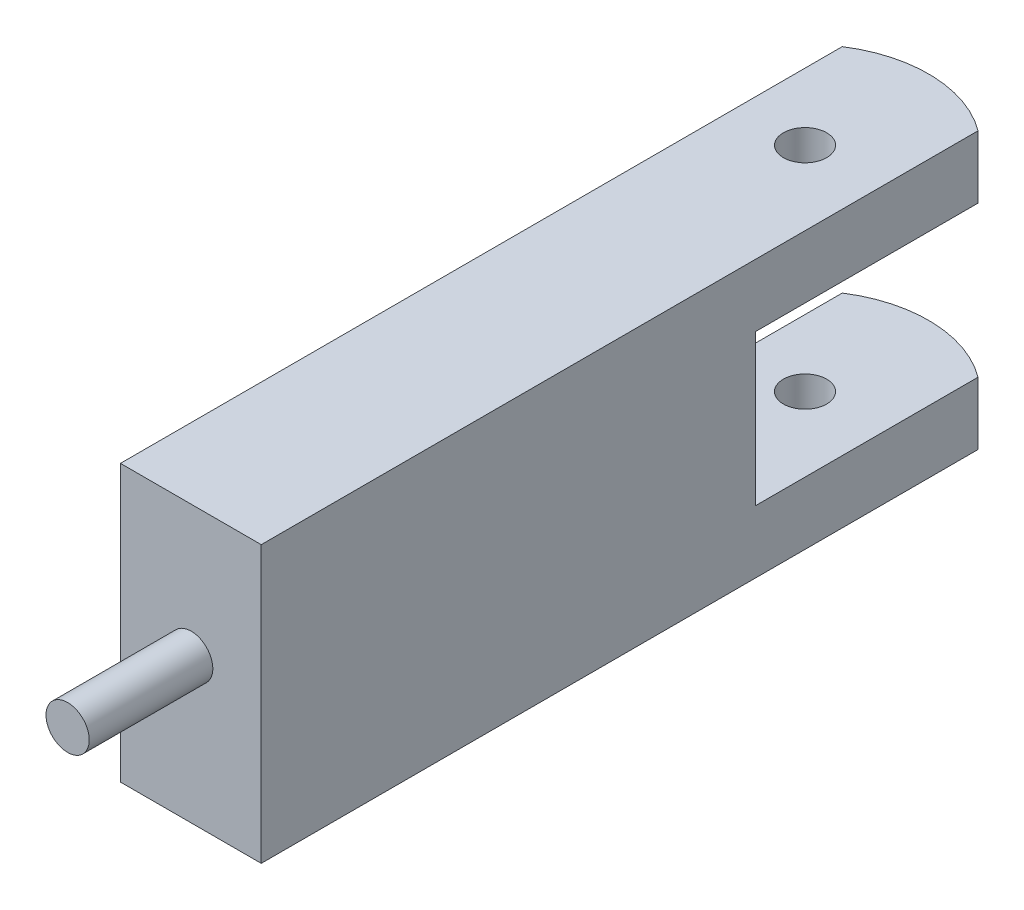
ISO-10303-21;
HEADER;
FILE_DESCRIPTION(('STEP AP214'),'2;1');
FILE_NAME('part.step','',(''),(''),'','','');
FILE_SCHEMA(('AUTOMOTIVE_DESIGN { 1 0 10303 214 1 1 1 1 }'));
ENDSEC;
DATA;
#1=APPLICATION_CONTEXT('core data for automotive mechanical design processes');
#2=APPLICATION_PROTOCOL_DEFINITION('international standard','automotive_design',2000,#1);
#3=PRODUCT_CONTEXT('',#1,'mechanical');
#4=PRODUCT('Part','Part','',(#3));
#5=PRODUCT_RELATED_PRODUCT_CATEGORY('part','',(#4));
#6=PRODUCT_DEFINITION_FORMATION('','',#4);
#7=PRODUCT_DEFINITION_CONTEXT('part definition',#1,'design');
#8=PRODUCT_DEFINITION('design','',#6,#7);
#9=PRODUCT_DEFINITION_SHAPE('','',#8);
#10=(LENGTH_UNIT() NAMED_UNIT(*) SI_UNIT(.MILLI.,.METRE.));
#11=(NAMED_UNIT(*) PLANE_ANGLE_UNIT() SI_UNIT($,.RADIAN.));
#12=(NAMED_UNIT(*) SI_UNIT($,.STERADIAN.) SOLID_ANGLE_UNIT());
#13=UNCERTAINTY_MEASURE_WITH_UNIT(LENGTH_MEASURE(1.E-05),#10,'distance_accuracy_value','');
#14=(GEOMETRIC_REPRESENTATION_CONTEXT(3) GLOBAL_UNCERTAINTY_ASSIGNED_CONTEXT((#13)) GLOBAL_UNIT_ASSIGNED_CONTEXT((#10,
#11,#12)) REPRESENTATION_CONTEXT('',''));
#15=CARTESIAN_POINT('',(0.,0.,0.));
#16=DIRECTION('',(0.,0.,1.));
#17=DIRECTION('',(1.,0.,0.));
#18=AXIS2_PLACEMENT_3D('',#15,#16,#17);
#19=CARTESIAN_POINT('',(15.,30.,-10.));
#20=DIRECTION('',(0.,-1.,0.));
#21=DIRECTION('',(0.,0.,-1.));
#22=AXIS2_PLACEMENT_3D('',#19,#20,#21);
#23=CYLINDRICAL_SURFACE('',#22,10.);
#24=CARTESIAN_POINT('',(15.,21.1,-10.));
#25=DIRECTION('',(0.,-1.,0.));
#26=DIRECTION('',(0.,0.,-1.));
#27=AXIS2_PLACEMENT_3D('',#24,#25,#26);
#28=CIRCLE('',#27,10.);
#29=CARTESIAN_POINT('',(9.59688421875046,21.1,-18.4146503108811));
#30=VERTEX_POINT('',#29);
#31=CARTESIAN_POINT('',(20.9913406814155,21.1,-18.0064871722383));
#32=VERTEX_POINT('',#31);
#33=EDGE_CURVE('E142',#30,#32,#28,.T.);
#34=ORIENTED_EDGE('',*,*,#33,.F.);
#35=DIRECTION('',(0.,-1.,0.));
#36=VECTOR('',#35,1.);
#37=CARTESIAN_POINT('',(9.59688421875046,30.,-18.4146503108811));
#38=LINE('',#37,#36);
#39=CARTESIAN_POINT('',(9.59688421875046,26.1695650132619,-18.4146503108811));
#40=VERTEX_POINT('',#39);
#41=EDGE_CURVE('E173',#30,#40,#38,.F.);
#42=ORIENTED_EDGE('',*,*,#41,.T.);
#43=CARTESIAN_POINT('',(15.,26.1695650132619,-10.));
#44=DIRECTION('',(0.,-1.,0.));
#45=DIRECTION('',(0.,0.,-1.));
#46=AXIS2_PLACEMENT_3D('',#43,#44,#45);
#47=CIRCLE('',#46,10.);
#48=CARTESIAN_POINT('',(20.9913406814155,26.1695650132619,-18.0064871722383));
#49=VERTEX_POINT('',#48);
#50=EDGE_CURVE('E129',#40,#49,#47,.T.);
#51=ORIENTED_EDGE('',*,*,#50,.T.);
#52=DIRECTION('',(0.,-1.,0.));
#53=VECTOR('',#52,1.);
#54=CARTESIAN_POINT('',(20.9913406814155,30.,-18.0064871722383));
#55=LINE('',#54,#53);
#56=EDGE_CURVE('E167',#49,#32,#55,.T.);
#57=ORIENTED_EDGE('',*,*,#56,.T.);
#58=EDGE_LOOP('',(#34,#42,#51,#57));
#59=FACE_BOUND('',#58,.T.);
#60=ADVANCED_FACE('F35',(#59),#23,.T.);
#61=CARTESIAN_POINT('',(0.,0.,40.));
#62=DIRECTION('',(0.,0.,-1.));
#63=DIRECTION('',(-1.,0.,0.));
#64=AXIS2_PLACEMENT_3D('',#61,#62,#63);
#65=PLANE('',#64);
#66=CARTESIAN_POINT('',(15.3218011728875,15.5201279283282,40.));
#67=DIRECTION('',(0.,0.,-1.));
#68=DIRECTION('',(-1.,0.,0.));
#69=AXIS2_PLACEMENT_3D('',#66,#67,#68);
#70=CIRCLE('',#69,1.75);
#71=CARTESIAN_POINT('',(13.5718011728875,15.5201279283282,40.));
#72=VERTEX_POINT('',#71);
#73=EDGE_CURVE('E149',#72,#72,#70,.F.);
#74=ORIENTED_EDGE('',*,*,#73,.F.);
#75=EDGE_LOOP('',(#74));
#76=FACE_BOUND('',#75,.T.);
#77=DIRECTION('',(1.,0.,0.));
#78=VECTOR('',#77,1.);
#79=CARTESIAN_POINT('',(0.,26.1695650132619,40.));
#80=LINE('',#79,#78);
#81=CARTESIAN_POINT('',(9.59688421875046,26.1695650132619,40.));
#82=VERTEX_POINT('',#81);
#83=CARTESIAN_POINT('',(20.9913406814155,26.1695650132619,40.));
#84=VERTEX_POINT('',#83);
#85=EDGE_CURVE('E109',#82,#84,#80,.T.);
#86=ORIENTED_EDGE('',*,*,#85,.F.);
#87=DIRECTION('',(0.,1.,0.));
#88=VECTOR('',#87,1.);
#89=CARTESIAN_POINT('',(9.59688421875046,26.1695650132619,40.));
#90=LINE('',#89,#88);
#91=CARTESIAN_POINT('',(9.59688421875046,3.83043498673809,40.));
#92=VERTEX_POINT('',#91);
#93=EDGE_CURVE('E98',#92,#82,#90,.T.);
#94=ORIENTED_EDGE('',*,*,#93,.F.);
#95=DIRECTION('',(1.,0.,0.));
#96=VECTOR('',#95,1.);
#97=CARTESIAN_POINT('',(0.,3.83043498673809,40.));
#98=LINE('',#97,#96);
#99=CARTESIAN_POINT('',(20.9913406814155,3.83043498673809,40.));
#100=VERTEX_POINT('',#99);
#101=EDGE_CURVE('E107',#92,#100,#98,.T.);
#102=ORIENTED_EDGE('',*,*,#101,.T.);
#103=DIRECTION('',(0.,-1.,0.));
#104=VECTOR('',#103,1.);
#105=CARTESIAN_POINT('',(20.9913406814155,3.83043498673809,40.));
#106=LINE('',#105,#104);
#107=EDGE_CURVE('E57',#84,#100,#106,.T.);
#108=ORIENTED_EDGE('',*,*,#107,.F.);
#109=EDGE_LOOP('',(#86,#94,#102,#108));
#110=FACE_BOUND('',#109,.T.);
#111=ADVANCED_FACE('F37',(#76,#110),#65,.F.);
#112=CARTESIAN_POINT('',(15.,3.83043498673809,-10.));
#113=DIRECTION('',(0.,-1.,0.));
#114=DIRECTION('',(0.,0.,-1.));
#115=AXIS2_PLACEMENT_3D('',#112,#113,#114);
#116=CIRCLE('',#115,10.);
#117=CARTESIAN_POINT('',(9.59688421875046,3.83043498673809,-18.4146503108811));
#118=VERTEX_POINT('',#117);
#119=CARTESIAN_POINT('',(20.9913406814155,3.83043498673809,-18.0064871722383));
#120=VERTEX_POINT('',#119);
#121=EDGE_CURVE('E118',#118,#120,#116,.T.);
#122=ORIENTED_EDGE('',*,*,#121,.F.);
#123=DIRECTION('',(0.,-1.,0.));
#124=VECTOR('',#123,1.);
#125=CARTESIAN_POINT('',(9.59688421875046,30.,-18.4146503108811));
#126=LINE('',#125,#124);
#127=CARTESIAN_POINT('',(9.59688421875046,8.9,-18.4146503108811));
#128=VERTEX_POINT('',#127);
#129=EDGE_CURVE('E49',#118,#128,#126,.F.);
#130=ORIENTED_EDGE('',*,*,#129,.T.);
#131=CARTESIAN_POINT('',(15.,8.9,-10.));
#132=DIRECTION('',(0.,-1.,0.));
#133=DIRECTION('',(0.,0.,-1.));
#134=AXIS2_PLACEMENT_3D('',#131,#132,#133);
#135=CIRCLE('',#134,10.);
#136=CARTESIAN_POINT('',(20.9913406814155,8.9,-18.0064871722383));
#137=VERTEX_POINT('',#136);
#138=EDGE_CURVE('E146',#128,#137,#135,.T.);
#139=ORIENTED_EDGE('',*,*,#138,.T.);
#140=DIRECTION('',(0.,-1.,0.));
#141=VECTOR('',#140,1.);
#142=CARTESIAN_POINT('',(20.9913406814155,30.,-18.0064871722383));
#143=LINE('',#142,#141);
#144=EDGE_CURVE('E157',#137,#120,#143,.T.);
#145=ORIENTED_EDGE('',*,*,#144,.T.);
#146=EDGE_LOOP('',(#122,#130,#139,#145));
#147=FACE_BOUND('',#146,.T.);
#148=ADVANCED_FACE('F160',(#147),#23,.T.);
#149=CARTESIAN_POINT('',(15.,30.,-10.));
#150=DIRECTION('',(0.,-1.,0.));
#151=DIRECTION('',(0.,0.,-1.));
#152=AXIS2_PLACEMENT_3D('',#149,#150,#151);
#153=CYLINDRICAL_SURFACE('',#152,1.75);
#154=CARTESIAN_POINT('',(15.,8.9,-10.));
#155=DIRECTION('',(0.,-1.,0.));
#156=DIRECTION('',(0.,0.,-1.));
#157=AXIS2_PLACEMENT_3D('',#154,#155,#156);
#158=CIRCLE('',#157,1.75);
#159=CARTESIAN_POINT('',(15.,8.9,-11.75));
#160=VERTEX_POINT('',#159);
#161=EDGE_CURVE('E145',#160,#160,#158,.T.);
#162=ORIENTED_EDGE('',*,*,#161,.F.);
#163=EDGE_LOOP('',(#162));
#164=FACE_BOUND('',#163,.T.);
#165=CARTESIAN_POINT('',(15.,3.83043498673809,-10.));
#166=DIRECTION('',(0.,-1.,0.));
#167=DIRECTION('',(0.,0.,-1.));
#168=AXIS2_PLACEMENT_3D('',#165,#166,#167);
#169=CIRCLE('',#168,1.75);
#170=CARTESIAN_POINT('',(15.,3.83043498673809,-11.75));
#171=VERTEX_POINT('',#170);
#172=EDGE_CURVE('E115',#171,#171,#169,.T.);
#173=ORIENTED_EDGE('',*,*,#172,.T.);
#174=EDGE_LOOP('',(#173));
#175=FACE_BOUND('',#174,.T.);
#176=ADVANCED_FACE('F210',(#164,#175),#153,.F.);
#177=CARTESIAN_POINT('',(-14.5,0.,0.));
#178=DIRECTION('',(0.,0.,1.));
#179=DIRECTION('',(0.,-1.,0.));
#180=AXIS2_PLACEMENT_3D('',#177,#178,#179);
#181=PLANE('',#180);
#182=DIRECTION('',(1.,0.,0.));
#183=VECTOR('',#182,1.);
#184=CARTESIAN_POINT('',(-14.5,8.9,0.));
#185=LINE('',#184,#183);
#186=CARTESIAN_POINT('',(9.59688421875046,8.9,0.));
#187=VERTEX_POINT('',#186);
#188=CARTESIAN_POINT('',(20.9913406814155,8.9,0.));
#189=VERTEX_POINT('',#188);
#190=EDGE_CURVE('E136',#187,#189,#185,.T.);
#191=ORIENTED_EDGE('',*,*,#190,.F.);
#192=DIRECTION('',(0.,1.,0.));
#193=VECTOR('',#192,1.);
#194=CARTESIAN_POINT('',(9.59688421875046,0.,0.));
#195=LINE('',#194,#193);
#196=CARTESIAN_POINT('',(9.59688421875046,21.1,0.));
#197=VERTEX_POINT('',#196);
#198=EDGE_CURVE('E165',#187,#197,#195,.T.);
#199=ORIENTED_EDGE('',*,*,#198,.T.);
#200=DIRECTION('',(1.,0.,0.));
#201=VECTOR('',#200,1.);
#202=CARTESIAN_POINT('',(-14.5,21.1,0.));
#203=LINE('',#202,#201);
#204=CARTESIAN_POINT('',(20.9913406814155,21.1,0.));
#205=VERTEX_POINT('',#204);
#206=EDGE_CURVE('E135',#197,#205,#203,.T.);
#207=ORIENTED_EDGE('',*,*,#206,.T.);
#208=DIRECTION('',(0.,-1.,0.));
#209=VECTOR('',#208,1.);
#210=CARTESIAN_POINT('',(20.9913406814155,0.,0.));
#211=LINE('',#210,#209);
#212=EDGE_CURVE('E183',#205,#189,#211,.T.);
#213=ORIENTED_EDGE('',*,*,#212,.T.);
#214=EDGE_LOOP('',(#191,#199,#207,#213));
#215=FACE_BOUND('',#214,.T.);
#216=ADVANCED_FACE('F181',(#215),#181,.F.);
#217=CARTESIAN_POINT('',(-14.5,8.9,0.));
#218=DIRECTION('',(0.,-1.,0.));
#219=DIRECTION('',(0.,0.,-1.));
#220=AXIS2_PLACEMENT_3D('',#217,#218,#219);
#221=PLANE('',#220);
#222=ORIENTED_EDGE('',*,*,#161,.T.);
#223=EDGE_LOOP('',(#222));
#224=FACE_BOUND('',#223,.T.);
#225=ORIENTED_EDGE('',*,*,#138,.F.);
#226=DIRECTION('',(0.,0.,1.));
#227=VECTOR('',#226,1.);
#228=CARTESIAN_POINT('',(9.59688421875046,8.9,0.));
#229=LINE('',#228,#227);
#230=EDGE_CURVE('E120',#128,#187,#229,.T.);
#231=ORIENTED_EDGE('',*,*,#230,.T.);
#232=ORIENTED_EDGE('',*,*,#190,.T.);
#233=DIRECTION('',(0.,0.,-1.));
#234=VECTOR('',#233,1.);
#235=CARTESIAN_POINT('',(20.9913406814155,8.9,0.));
#236=LINE('',#235,#234);
#237=EDGE_CURVE('E163',#189,#137,#236,.T.);
#238=ORIENTED_EDGE('',*,*,#237,.T.);
#239=EDGE_LOOP('',(#225,#231,#232,#238));
#240=FACE_BOUND('',#239,.T.);
#241=ADVANCED_FACE('F178',(#224,#240),#221,.F.);
#242=CARTESIAN_POINT('',(-14.5,21.1,0.));
#243=DIRECTION('',(0.,-1.,0.));
#244=DIRECTION('',(0.,0.,-1.));
#245=AXIS2_PLACEMENT_3D('',#242,#243,#244);
#246=PLANE('',#245);
#247=DIRECTION('',(0.,0.,1.));
#248=VECTOR('',#247,1.);
#249=CARTESIAN_POINT('',(9.59688421875046,21.1,0.));
#250=LINE('',#249,#248);
#251=EDGE_CURVE('E162',#30,#197,#250,.T.);
#252=ORIENTED_EDGE('',*,*,#251,.F.);
#253=ORIENTED_EDGE('',*,*,#33,.T.);
#254=DIRECTION('',(0.,0.,-1.));
#255=VECTOR('',#254,1.);
#256=CARTESIAN_POINT('',(20.9913406814155,21.1,0.));
#257=LINE('',#256,#255);
#258=EDGE_CURVE('E185',#205,#32,#257,.T.);
#259=ORIENTED_EDGE('',*,*,#258,.F.);
#260=ORIENTED_EDGE('',*,*,#206,.F.);
#261=EDGE_LOOP('',(#252,#253,#259,#260));
#262=FACE_BOUND('',#261,.T.);
#263=CARTESIAN_POINT('',(15.,21.1,-10.));
#264=DIRECTION('',(0.,-1.,0.));
#265=DIRECTION('',(0.,0.,-1.));
#266=AXIS2_PLACEMENT_3D('',#263,#264,#265);
#267=CIRCLE('',#266,1.75);
#268=CARTESIAN_POINT('',(15.,21.1,-11.75));
#269=VERTEX_POINT('',#268);
#270=EDGE_CURVE('E139',#269,#269,#267,.T.);
#271=ORIENTED_EDGE('',*,*,#270,.F.);
#272=EDGE_LOOP('',(#271));
#273=FACE_BOUND('',#272,.T.);
#274=ADVANCED_FACE('F200',(#262,#273),#246,.T.);
#275=CARTESIAN_POINT('',(15.,26.1695650132619,-10.));
#276=DIRECTION('',(0.,-1.,0.));
#277=DIRECTION('',(0.,0.,-1.));
#278=AXIS2_PLACEMENT_3D('',#275,#276,#277);
#279=CIRCLE('',#278,1.75);
#280=CARTESIAN_POINT('',(15.,26.1695650132619,-11.75));
#281=VERTEX_POINT('',#280);
#282=EDGE_CURVE('E126',#281,#281,#279,.T.);
#283=ORIENTED_EDGE('',*,*,#282,.F.);
#284=EDGE_LOOP('',(#283));
#285=FACE_BOUND('',#284,.T.);
#286=ORIENTED_EDGE('',*,*,#270,.T.);
#287=EDGE_LOOP('',(#286));
#288=FACE_BOUND('',#287,.T.);
#289=ADVANCED_FACE('F203',(#285,#288),#153,.F.);
#290=CARTESIAN_POINT('',(15.3218011728875,15.5201279283282,50.));
#291=DIRECTION('',(0.,0.,-1.));
#292=DIRECTION('',(-1.,0.,0.));
#293=AXIS2_PLACEMENT_3D('',#290,#291,#292);
#294=CYLINDRICAL_SURFACE('',#293,1.75);
#295=CARTESIAN_POINT('',(15.3218011728875,15.5201279283282,50.));
#296=DIRECTION('',(0.,0.,1.));
#297=DIRECTION('',(1.,0.,0.));
#298=AXIS2_PLACEMENT_3D('',#295,#296,#297);
#299=CIRCLE('',#298,1.75);
#300=CARTESIAN_POINT('',(17.0718011728875,15.5201279283282,50.));
#301=VERTEX_POINT('',#300);
#302=EDGE_CURVE('E132',#301,#301,#299,.T.);
#303=ORIENTED_EDGE('',*,*,#302,.F.);
#304=EDGE_LOOP('',(#303));
#305=FACE_BOUND('',#304,.T.);
#306=ORIENTED_EDGE('',*,*,#73,.T.);
#307=EDGE_LOOP('',(#306));
#308=FACE_BOUND('',#307,.T.);
#309=ADVANCED_FACE('F208',(#305,#308),#294,.T.);
#310=CARTESIAN_POINT('',(15.3218011728875,15.5201279283282,50.));
#311=DIRECTION('',(0.,0.,1.));
#312=DIRECTION('',(1.,0.,0.));
#313=AXIS2_PLACEMENT_3D('',#310,#311,#312);
#314=PLANE('',#313);
#315=ORIENTED_EDGE('',*,*,#302,.T.);
#316=EDGE_LOOP('',(#315));
#317=FACE_BOUND('',#316,.T.);
#318=ADVANCED_FACE('F216',(#317),#314,.T.);
#319=CARTESIAN_POINT('',(0.,26.1695650132619,-27.));
#320=DIRECTION('',(0.,-1.,0.));
#321=DIRECTION('',(0.,0.,-1.));
#322=AXIS2_PLACEMENT_3D('',#319,#320,#321);
#323=PLANE('',#322);
#324=ORIENTED_EDGE('',*,*,#282,.T.);
#325=EDGE_LOOP('',(#324));
#326=FACE_BOUND('',#325,.T.);
#327=ORIENTED_EDGE('',*,*,#50,.F.);
#328=DIRECTION('',(0.,0.,1.));
#329=VECTOR('',#328,1.);
#330=CARTESIAN_POINT('',(9.59688421875046,26.1695650132619,-27.));
#331=LINE('',#330,#329);
#332=EDGE_CURVE('E110',#40,#82,#331,.T.);
#333=ORIENTED_EDGE('',*,*,#332,.T.);
#334=ORIENTED_EDGE('',*,*,#85,.T.);
#335=DIRECTION('',(0.,0.,1.));
#336=VECTOR('',#335,1.);
#337=CARTESIAN_POINT('',(20.9913406814155,26.1695650132619,-27.));
#338=LINE('',#337,#336);
#339=EDGE_CURVE('E111',#49,#84,#338,.T.);
#340=ORIENTED_EDGE('',*,*,#339,.F.);
#341=EDGE_LOOP('',(#327,#333,#334,#340));
#342=FACE_BOUND('',#341,.T.);
#343=ADVANCED_FACE('F194',(#326,#342),#323,.F.);
#344=CARTESIAN_POINT('',(0.,3.83043498673809,-27.));
#345=DIRECTION('',(0.,-1.,0.));
#346=DIRECTION('',(0.,0.,-1.));
#347=AXIS2_PLACEMENT_3D('',#344,#345,#346);
#348=PLANE('',#347);
#349=DIRECTION('',(0.,0.,1.));
#350=VECTOR('',#349,1.);
#351=CARTESIAN_POINT('',(9.59688421875046,3.83043498673809,-27.));
#352=LINE('',#351,#350);
#353=EDGE_CURVE('E11',#118,#92,#352,.T.);
#354=ORIENTED_EDGE('',*,*,#353,.F.);
#355=ORIENTED_EDGE('',*,*,#121,.T.);
#356=DIRECTION('',(0.,0.,-1.));
#357=VECTOR('',#356,1.);
#358=CARTESIAN_POINT('',(20.9913406814155,3.83043498673809,-27.));
#359=LINE('',#358,#357);
#360=EDGE_CURVE('E43',#100,#120,#359,.T.);
#361=ORIENTED_EDGE('',*,*,#360,.F.);
#362=ORIENTED_EDGE('',*,*,#101,.F.);
#363=EDGE_LOOP('',(#354,#355,#361,#362));
#364=FACE_BOUND('',#363,.T.);
#365=ORIENTED_EDGE('',*,*,#172,.F.);
#366=EDGE_LOOP('',(#365));
#367=FACE_BOUND('',#366,.T.);
#368=ADVANCED_FACE('F113',(#364,#367),#348,.T.);
#369=CARTESIAN_POINT('',(20.9913406814155,3.83043498673809,-27.));
#370=DIRECTION('',(-1.,0.,0.));
#371=DIRECTION('',(0.,0.,1.));
#372=AXIS2_PLACEMENT_3D('',#369,#370,#371);
#373=PLANE('',#372);
#374=ORIENTED_EDGE('',*,*,#237,.F.);
#375=ORIENTED_EDGE('',*,*,#212,.F.);
#376=ORIENTED_EDGE('',*,*,#258,.T.);
#377=ORIENTED_EDGE('',*,*,#56,.F.);
#378=ORIENTED_EDGE('',*,*,#339,.T.);
#379=ORIENTED_EDGE('',*,*,#107,.T.);
#380=ORIENTED_EDGE('',*,*,#360,.T.);
#381=ORIENTED_EDGE('',*,*,#144,.F.);
#382=EDGE_LOOP('',(#374,#375,#376,#377,#378,#379,#380,#381));
#383=FACE_BOUND('',#382,.T.);
#384=ADVANCED_FACE('F156',(#383),#373,.F.);
#385=CARTESIAN_POINT('',(9.59688421875046,26.1695650132619,-27.));
#386=DIRECTION('',(1.,0.,0.));
#387=DIRECTION('',(0.,1.,0.));
#388=AXIS2_PLACEMENT_3D('',#385,#386,#387);
#389=PLANE('',#388);
#390=ORIENTED_EDGE('',*,*,#353,.T.);
#391=ORIENTED_EDGE('',*,*,#93,.T.);
#392=ORIENTED_EDGE('',*,*,#332,.F.);
#393=ORIENTED_EDGE('',*,*,#41,.F.);
#394=ORIENTED_EDGE('',*,*,#251,.T.);
#395=ORIENTED_EDGE('',*,*,#198,.F.);
#396=ORIENTED_EDGE('',*,*,#230,.F.);
#397=ORIENTED_EDGE('',*,*,#129,.F.);
#398=EDGE_LOOP('',(#390,#391,#392,#393,#394,#395,#396,#397));
#399=FACE_BOUND('',#398,.T.);
#400=ADVANCED_FACE('F97',(#399),#389,.F.);
#401=CLOSED_SHELL('',(#60,#111,#148,#176,#216,#241,#274,#289,#309,#318,#343,#368,#384,#400));
#402=MANIFOLD_SOLID_BREP('B2',#401);
#403=ADVANCED_BREP_SHAPE_REPRESENTATION('',(#18,#402),#14);
#404=SHAPE_DEFINITION_REPRESENTATION(#9,#403);
ENDSEC;
END-ISO-10303-21;
